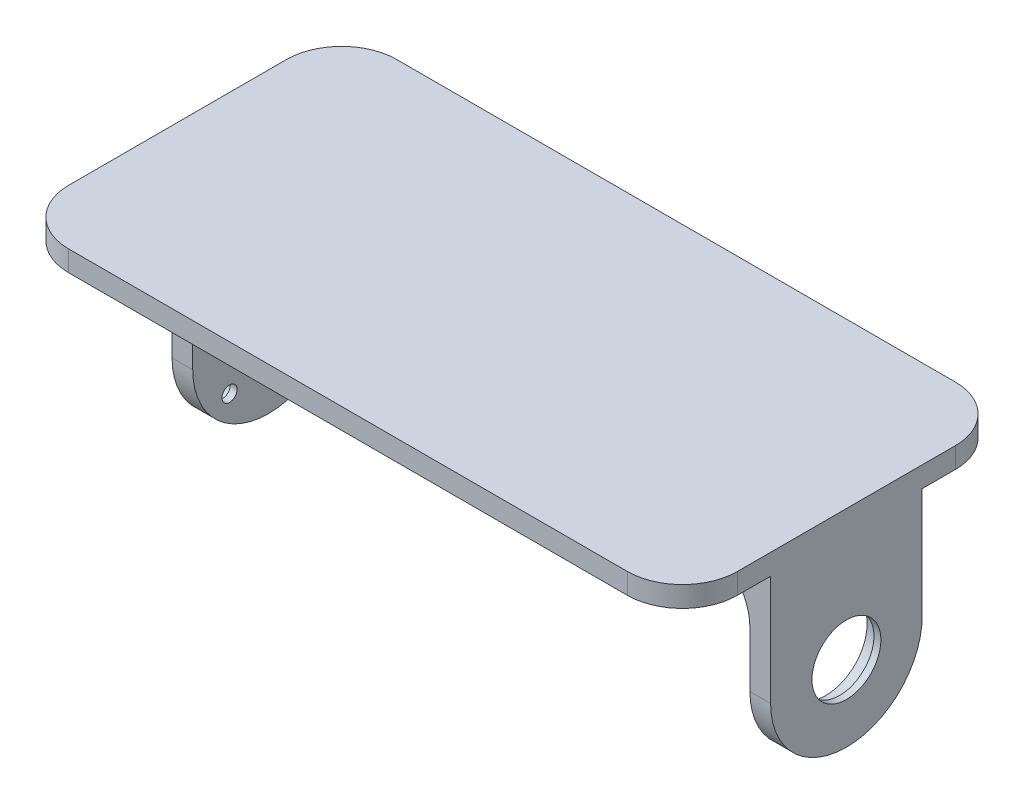
ISO-10303-21;
HEADER;
FILE_DESCRIPTION(('STEP AP214'),'2;1');
FILE_NAME('part.step','',(''),(''),'','','');
FILE_SCHEMA(('AUTOMOTIVE_DESIGN { 1 0 10303 214 1 1 1 1 }'));
ENDSEC;
DATA;
#1=APPLICATION_CONTEXT('core data for automotive mechanical design processes');
#2=APPLICATION_PROTOCOL_DEFINITION('international standard','automotive_design',2000,#1);
#3=PRODUCT_CONTEXT('',#1,'mechanical');
#4=PRODUCT('Part','Part','',(#3));
#5=PRODUCT_RELATED_PRODUCT_CATEGORY('part','',(#4));
#6=PRODUCT_DEFINITION_FORMATION('','',#4);
#7=PRODUCT_DEFINITION_CONTEXT('part definition',#1,'design');
#8=PRODUCT_DEFINITION('design','',#6,#7);
#9=PRODUCT_DEFINITION_SHAPE('','',#8);
#10=(LENGTH_UNIT() NAMED_UNIT(*) SI_UNIT(.MILLI.,.METRE.));
#11=(NAMED_UNIT(*) PLANE_ANGLE_UNIT() SI_UNIT($,.RADIAN.));
#12=(NAMED_UNIT(*) SI_UNIT($,.STERADIAN.) SOLID_ANGLE_UNIT());
#13=UNCERTAINTY_MEASURE_WITH_UNIT(LENGTH_MEASURE(1.E-05),#10,'distance_accuracy_value','');
#14=(GEOMETRIC_REPRESENTATION_CONTEXT(3) GLOBAL_UNCERTAINTY_ASSIGNED_CONTEXT((#13)) GLOBAL_UNIT_ASSIGNED_CONTEXT((#10,
#11,#12)) REPRESENTATION_CONTEXT('',''));
#15=CARTESIAN_POINT('',(0.,0.,0.));
#16=DIRECTION('',(0.,0.,1.));
#17=DIRECTION('',(1.,0.,0.));
#18=AXIS2_PLACEMENT_3D('',#15,#16,#17);
#19=CARTESIAN_POINT('',(-30.6037704958123,-21.6568542494924,5.65685424949241));
#20=DIRECTION('',(-1.,0.,0.));
#21=DIRECTION('',(0.,0.,-1.));
#22=AXIS2_PLACEMENT_3D('',#19,#20,#21);
#23=CYLINDRICAL_SURFACE('',#22,1.1);
#24=CARTESIAN_POINT('',(-39.0890518700509,-21.6568542494924,5.65685424949241));
#25=DIRECTION('',(1.,0.,0.));
#26=DIRECTION('',(0.,0.,-1.));
#27=AXIS2_PLACEMENT_3D('',#24,#25,#26);
#28=CIRCLE('',#27,1.1);
#29=CARTESIAN_POINT('',(-39.0890518700509,-21.6568542494924,4.55685424949241));
#30=VERTEX_POINT('',#29);
#31=EDGE_CURVE('E551',#30,#30,#28,.F.);
#32=ORIENTED_EDGE('',*,*,#31,.F.);
#33=EDGE_LOOP('',(#32));
#34=FACE_BOUND('',#33,.T.);
#35=CARTESIAN_POINT('',(-40.0890518700509,-21.6568542494924,5.65685424949241));
#36=DIRECTION('',(1.,0.,0.));
#37=DIRECTION('',(0.,0.,-1.));
#38=AXIS2_PLACEMENT_3D('',#35,#36,#37);
#39=CIRCLE('',#38,1.1);
#40=CARTESIAN_POINT('',(-40.0890518700509,-21.6568542494924,4.55685424949241));
#41=VERTEX_POINT('',#40);
#42=EDGE_CURVE('E276',#41,#41,#39,.F.);
#43=ORIENTED_EDGE('',*,*,#42,.T.);
#44=EDGE_LOOP('',(#43));
#45=FACE_BOUND('',#44,.T.);
#46=ADVANCED_FACE('F37',(#34,#45),#23,.F.);
#47=CARTESIAN_POINT('',(-30.6037704958123,-21.6568542494924,-5.65685424949237));
#48=DIRECTION('',(-1.,0.,0.));
#49=DIRECTION('',(0.,0.,-1.));
#50=AXIS2_PLACEMENT_3D('',#47,#48,#49);
#51=CYLINDRICAL_SURFACE('',#50,1.1);
#52=CARTESIAN_POINT('',(-39.0890518700509,-21.6568542494924,-5.65685424949237));
#53=DIRECTION('',(1.,0.,0.));
#54=DIRECTION('',(0.,0.,-1.));
#55=AXIS2_PLACEMENT_3D('',#52,#53,#54);
#56=CIRCLE('',#55,1.1);
#57=CARTESIAN_POINT('',(-39.0890518700509,-21.6568542494924,-6.75685424949237));
#58=VERTEX_POINT('',#57);
#59=EDGE_CURVE('E548',#58,#58,#56,.F.);
#60=ORIENTED_EDGE('',*,*,#59,.F.);
#61=EDGE_LOOP('',(#60));
#62=FACE_BOUND('',#61,.T.);
#63=CARTESIAN_POINT('',(-40.0890518700509,-21.6568542494924,-5.65685424949237));
#64=DIRECTION('',(1.,0.,0.));
#65=DIRECTION('',(0.,0.,-1.));
#66=AXIS2_PLACEMENT_3D('',#63,#64,#65);
#67=CIRCLE('',#66,1.1);
#68=CARTESIAN_POINT('',(-40.0890518700509,-21.6568542494924,-6.75685424949237));
#69=VERTEX_POINT('',#68);
#70=EDGE_CURVE('E272',#69,#69,#67,.F.);
#71=ORIENTED_EDGE('',*,*,#70,.T.);
#72=EDGE_LOOP('',(#71));
#73=FACE_BOUND('',#72,.T.);
#74=ADVANCED_FACE('F409',(#62,#73),#51,.F.);
#75=CARTESIAN_POINT('',(-30.6037704958123,-10.3431457505077,5.65685424949241));
#76=DIRECTION('',(-1.,0.,0.));
#77=DIRECTION('',(0.,0.,-1.));
#78=AXIS2_PLACEMENT_3D('',#75,#76,#77);
#79=CYLINDRICAL_SURFACE('',#78,1.1);
#80=CARTESIAN_POINT('',(-39.0890518700509,-10.3431457505077,5.65685424949241));
#81=DIRECTION('',(1.,0.,0.));
#82=DIRECTION('',(0.,0.,-1.));
#83=AXIS2_PLACEMENT_3D('',#80,#81,#82);
#84=CIRCLE('',#83,1.1);
#85=CARTESIAN_POINT('',(-39.0890518700509,-10.3431457505077,4.55685424949241));
#86=VERTEX_POINT('',#85);
#87=EDGE_CURVE('E262',#86,#86,#84,.F.);
#88=ORIENTED_EDGE('',*,*,#87,.F.);
#89=EDGE_LOOP('',(#88));
#90=FACE_BOUND('',#89,.T.);
#91=CARTESIAN_POINT('',(-40.0890518700509,-10.3431457505077,5.65685424949241));
#92=DIRECTION('',(1.,0.,0.));
#93=DIRECTION('',(0.,0.,-1.));
#94=AXIS2_PLACEMENT_3D('',#91,#92,#93);
#95=CIRCLE('',#94,1.1);
#96=CARTESIAN_POINT('',(-40.0890518700509,-10.3431457505077,4.55685424949241));
#97=VERTEX_POINT('',#96);
#98=EDGE_CURVE('E269',#97,#97,#95,.F.);
#99=ORIENTED_EDGE('',*,*,#98,.T.);
#100=EDGE_LOOP('',(#99));
#101=FACE_BOUND('',#100,.T.);
#102=ADVANCED_FACE('F415',(#90,#101),#79,.F.);
#103=CARTESIAN_POINT('',(-30.6037704958123,-10.3431457505077,-5.65685424949241));
#104=DIRECTION('',(-1.,0.,0.));
#105=DIRECTION('',(0.,0.,-1.));
#106=AXIS2_PLACEMENT_3D('',#103,#104,#105);
#107=CYLINDRICAL_SURFACE('',#106,1.1);
#108=CARTESIAN_POINT('',(-39.0890518700509,-10.3431457505077,-5.65685424949241));
#109=DIRECTION('',(1.,0.,0.));
#110=DIRECTION('',(0.,0.,-1.));
#111=AXIS2_PLACEMENT_3D('',#108,#109,#110);
#112=CIRCLE('',#111,1.1);
#113=CARTESIAN_POINT('',(-39.0890518700509,-10.3431457505077,-6.75685424949241));
#114=VERTEX_POINT('',#113);
#115=EDGE_CURVE('E545',#114,#114,#112,.F.);
#116=ORIENTED_EDGE('',*,*,#115,.F.);
#117=EDGE_LOOP('',(#116));
#118=FACE_BOUND('',#117,.T.);
#119=CARTESIAN_POINT('',(-40.0890518700509,-10.3431457505077,-5.65685424949241));
#120=DIRECTION('',(1.,0.,0.));
#121=DIRECTION('',(0.,0.,-1.));
#122=AXIS2_PLACEMENT_3D('',#119,#120,#121);
#123=CIRCLE('',#122,1.1);
#124=CARTESIAN_POINT('',(-40.0890518700509,-10.3431457505077,-6.75685424949241));
#125=VERTEX_POINT('',#124);
#126=EDGE_CURVE('E265',#125,#125,#123,.F.);
#127=ORIENTED_EDGE('',*,*,#126,.T.);
#128=EDGE_LOOP('',(#127));
#129=FACE_BOUND('',#128,.T.);
#130=ADVANCED_FACE('F450',(#118,#129),#107,.F.);
#131=CARTESIAN_POINT('',(0.,0.,0.));
#132=DIRECTION('',(0.,1.,0.));
#133=DIRECTION('',(0.,0.,-1.));
#134=AXIS2_PLACEMENT_3D('',#131,#132,#133);
#135=PLANE('',#134);
#136=DIRECTION('',(1.,0.,0.));
#137=VECTOR('',#136,1.);
#138=CARTESIAN_POINT('',(-42.0890518700509,0.,11.));
#139=LINE('',#138,#137);
#140=CARTESIAN_POINT('',(-50.0890518700509,0.,11.));
#141=VERTEX_POINT('',#140);
#142=CARTESIAN_POINT('',(-31.0890518700509,0.,11.));
#143=VERTEX_POINT('',#142);
#144=EDGE_CURVE('E348',#141,#143,#139,.T.);
#145=ORIENTED_EDGE('',*,*,#144,.T.);
#146=DIRECTION('',(0.,0.,-1.));
#147=VECTOR('',#146,1.);
#148=CARTESIAN_POINT('',(-31.0890518700509,0.,11.));
#149=LINE('',#148,#147);
#150=CARTESIAN_POINT('',(-31.0890518700509,0.,-11.));
#151=VERTEX_POINT('',#150);
#152=EDGE_CURVE('E284',#151,#143,#149,.F.);
#153=ORIENTED_EDGE('',*,*,#152,.F.);
#154=DIRECTION('',(-1.,0.,0.));
#155=VECTOR('',#154,1.);
#156=CARTESIAN_POINT('',(-42.0890518700509,0.,-11.));
#157=LINE('',#156,#155);
#158=CARTESIAN_POINT('',(-50.0890518700509,0.,-11.));
#159=VERTEX_POINT('',#158);
#160=EDGE_CURVE('E342',#151,#159,#157,.T.);
#161=ORIENTED_EDGE('',*,*,#160,.T.);
#162=DIRECTION('',(0.,0.,1.));
#163=VECTOR('',#162,1.);
#164=CARTESIAN_POINT('',(-50.0890518700509,0.,-11.));
#165=LINE('',#164,#163);
#166=EDGE_CURVE('E289',#141,#159,#165,.F.);
#167=ORIENTED_EDGE('',*,*,#166,.F.);
#168=EDGE_LOOP('',(#145,#153,#161,#167));
#169=FACE_BOUND('',#168,.T.);
#170=DIRECTION('',(1.,0.,0.));
#171=VECTOR('',#170,1.);
#172=CARTESIAN_POINT('',(-52.2890518700509,0.,-23.8));
#173=LINE('',#172,#171);
#174=CARTESIAN_POINT('',(-44.2890518700509,0.,-23.8));
#175=VERTEX_POINT('',#174);
#176=CARTESIAN_POINT('',(36.7609481299491,0.,-23.8));
#177=VERTEX_POINT('',#176);
#178=EDGE_CURVE('E214',#175,#177,#173,.T.);
#179=ORIENTED_EDGE('',*,*,#178,.T.);
#180=CARTESIAN_POINT('',(36.7609481299491,0.,-15.8));
#181=DIRECTION('',(0.,-1.,0.));
#182=DIRECTION('',(0.,0.,-1.));
#183=AXIS2_PLACEMENT_3D('',#180,#181,#182);
#184=CIRCLE('',#183,8.);
#185=CARTESIAN_POINT('',(44.7609481299491,0.,-15.8));
#186=VERTEX_POINT('',#185);
#187=EDGE_CURVE('E209',#186,#177,#184,.F.);
#188=ORIENTED_EDGE('',*,*,#187,.F.);
#189=DIRECTION('',(0.,0.,-1.));
#190=VECTOR('',#189,1.);
#191=CARTESIAN_POINT('',(44.7609481299491,0.,-11.));
#192=LINE('',#191,#190);
#193=CARTESIAN_POINT('',(44.7609481299491,0.,-11.));
#194=VERTEX_POINT('',#193);
#195=EDGE_CURVE('E187',#194,#186,#192,.T.);
#196=ORIENTED_EDGE('',*,*,#195,.F.);
#197=DIRECTION('',(-1.,0.,0.));
#198=VECTOR('',#197,1.);
#199=CARTESIAN_POINT('',(41.7609481299491,0.,-11.));
#200=LINE('',#199,#198);
#201=CARTESIAN_POINT('',(33.7609481299491,0.,-11.));
#202=VERTEX_POINT('',#201);
#203=EDGE_CURVE('E197',#194,#202,#200,.T.);
#204=ORIENTED_EDGE('',*,*,#203,.T.);
#205=DIRECTION('',(0.,0.,1.));
#206=VECTOR('',#205,1.);
#207=CARTESIAN_POINT('',(33.7609481299491,0.,-11.));
#208=LINE('',#207,#206);
#209=CARTESIAN_POINT('',(33.7609481299491,0.,11.));
#210=VERTEX_POINT('',#209);
#211=EDGE_CURVE('E287',#210,#202,#208,.F.);
#212=ORIENTED_EDGE('',*,*,#211,.F.);
#213=DIRECTION('',(1.,0.,0.));
#214=VECTOR('',#213,1.);
#215=CARTESIAN_POINT('',(41.7609481299491,0.,11.));
#216=LINE('',#215,#214);
#217=CARTESIAN_POINT('',(44.7609481299491,0.,11.));
#218=VERTEX_POINT('',#217);
#219=EDGE_CURVE('E204',#210,#218,#216,.T.);
#220=ORIENTED_EDGE('',*,*,#219,.T.);
#221=CARTESIAN_POINT('',(44.7609481299491,0.,15.8));
#222=VERTEX_POINT('',#221);
#223=EDGE_CURVE('E210',#222,#218,#192,.T.);
#224=ORIENTED_EDGE('',*,*,#223,.F.);
#225=CARTESIAN_POINT('',(36.7609481299491,0.,15.8));
#226=DIRECTION('',(0.,-1.,0.));
#227=DIRECTION('',(0.,0.,-1.));
#228=AXIS2_PLACEMENT_3D('',#225,#226,#227);
#229=CIRCLE('',#228,8.);
#230=CARTESIAN_POINT('',(36.7609481299491,0.,23.8));
#231=VERTEX_POINT('',#230);
#232=EDGE_CURVE('E295',#231,#222,#229,.F.);
#233=ORIENTED_EDGE('',*,*,#232,.F.);
#234=DIRECTION('',(-1.,0.,0.));
#235=VECTOR('',#234,1.);
#236=CARTESIAN_POINT('',(44.7609481299491,0.,23.8));
#237=LINE('',#236,#235);
#238=CARTESIAN_POINT('',(-44.2890518700509,0.,23.8));
#239=VERTEX_POINT('',#238);
#240=EDGE_CURVE('E226',#231,#239,#237,.T.);
#241=ORIENTED_EDGE('',*,*,#240,.T.);
#242=CARTESIAN_POINT('',(-44.2890518700509,0.,15.8));
#243=DIRECTION('',(0.,-1.,0.));
#244=DIRECTION('',(0.,0.,-1.));
#245=AXIS2_PLACEMENT_3D('',#242,#243,#244);
#246=CIRCLE('',#245,8.);
#247=CARTESIAN_POINT('',(-52.2890518700509,0.,15.8));
#248=VERTEX_POINT('',#247);
#249=EDGE_CURVE('E292',#248,#239,#246,.F.);
#250=ORIENTED_EDGE('',*,*,#249,.F.);
#251=DIRECTION('',(0.,0.,1.));
#252=VECTOR('',#251,1.);
#253=CARTESIAN_POINT('',(-52.2890518700509,0.,11.));
#254=LINE('',#253,#252);
#255=CARTESIAN_POINT('',(-52.2890518700509,0.,-15.8));
#256=VERTEX_POINT('',#255);
#257=EDGE_CURVE('E223',#256,#248,#254,.T.);
#258=ORIENTED_EDGE('',*,*,#257,.F.);
#259=CARTESIAN_POINT('',(-44.2890518700509,0.,-15.8));
#260=DIRECTION('',(0.,-1.,0.));
#261=DIRECTION('',(0.,0.,-1.));
#262=AXIS2_PLACEMENT_3D('',#259,#260,#261);
#263=CIRCLE('',#262,8.);
#264=EDGE_CURVE('E299',#175,#256,#263,.F.);
#265=ORIENTED_EDGE('',*,*,#264,.F.);
#266=EDGE_LOOP('',(#179,#188,#196,#204,#212,#220,#224,#233,#241,#250,#258,#265));
#267=FACE_BOUND('',#266,.T.);
#268=ADVANCED_FACE('F207',(#169,#267),#135,.F.);
#269=CARTESIAN_POINT('',(44.7609481299491,3.,23.8));
#270=DIRECTION('',(0.,0.,-1.));
#271=DIRECTION('',(1.,0.,0.));
#272=AXIS2_PLACEMENT_3D('',#269,#270,#271);
#273=PLANE('',#272);
#274=DIRECTION('',(-1.,0.,0.));
#275=VECTOR('',#274,1.);
#276=CARTESIAN_POINT('',(44.7609481299491,3.,23.8));
#277=LINE('',#276,#275);
#278=CARTESIAN_POINT('',(36.7609481299491,3.,23.8));
#279=VERTEX_POINT('',#278);
#280=CARTESIAN_POINT('',(-44.2890518700509,3.,23.8));
#281=VERTEX_POINT('',#280);
#282=EDGE_CURVE('E220',#279,#281,#277,.T.);
#283=ORIENTED_EDGE('',*,*,#282,.T.);
#284=DIRECTION('',(0.,-1.,0.));
#285=VECTOR('',#284,1.);
#286=CARTESIAN_POINT('',(-44.2890518700509,3.,23.8));
#287=LINE('',#286,#285);
#288=EDGE_CURVE('E320',#239,#281,#287,.F.);
#289=ORIENTED_EDGE('',*,*,#288,.F.);
#290=ORIENTED_EDGE('',*,*,#240,.F.);
#291=DIRECTION('',(0.,-1.,0.));
#292=VECTOR('',#291,1.);
#293=CARTESIAN_POINT('',(36.7609481299491,0.,23.8));
#294=LINE('',#293,#292);
#295=EDGE_CURVE('E323',#279,#231,#294,.T.);
#296=ORIENTED_EDGE('',*,*,#295,.F.);
#297=EDGE_LOOP('',(#283,#289,#290,#296));
#298=FACE_BOUND('',#297,.T.);
#299=ADVANCED_FACE('F376',(#298),#273,.F.);
#300=CARTESIAN_POINT('',(-52.2890518700509,3.,11.));
#301=DIRECTION('',(-1.,0.,0.));
#302=DIRECTION('',(0.,0.,-1.));
#303=AXIS2_PLACEMENT_3D('',#300,#301,#302);
#304=PLANE('',#303);
#305=ORIENTED_EDGE('',*,*,#257,.T.);
#306=DIRECTION('',(0.,-1.,0.));
#307=VECTOR('',#306,1.);
#308=CARTESIAN_POINT('',(-52.2890518700509,0.,15.8));
#309=LINE('',#308,#307);
#310=CARTESIAN_POINT('',(-52.2890518700509,3.,15.8));
#311=VERTEX_POINT('',#310);
#312=EDGE_CURVE('E302',#311,#248,#309,.T.);
#313=ORIENTED_EDGE('',*,*,#312,.F.);
#314=DIRECTION('',(0.,0.,-1.));
#315=VECTOR('',#314,1.);
#316=CARTESIAN_POINT('',(-52.2890518700509,3.,-11.));
#317=LINE('',#316,#315);
#318=CARTESIAN_POINT('',(-52.2890518700509,3.,-15.8));
#319=VERTEX_POINT('',#318);
#320=EDGE_CURVE('E367',#311,#319,#317,.T.);
#321=ORIENTED_EDGE('',*,*,#320,.T.);
#322=DIRECTION('',(0.,-1.,0.));
#323=VECTOR('',#322,1.);
#324=CARTESIAN_POINT('',(-52.2890518700509,3.,-15.8));
#325=LINE('',#324,#323);
#326=EDGE_CURVE('E304',#256,#319,#325,.F.);
#327=ORIENTED_EDGE('',*,*,#326,.F.);
#328=EDGE_LOOP('',(#305,#313,#321,#327));
#329=FACE_BOUND('',#328,.T.);
#330=ADVANCED_FACE('F399',(#329),#304,.T.);
#331=CARTESIAN_POINT('',(-52.2890518700509,3.,-23.8));
#332=DIRECTION('',(0.,0.,1.));
#333=DIRECTION('',(-1.,0.,0.));
#334=AXIS2_PLACEMENT_3D('',#331,#332,#333);
#335=PLANE('',#334);
#336=DIRECTION('',(1.,0.,0.));
#337=VECTOR('',#336,1.);
#338=CARTESIAN_POINT('',(-52.2890518700509,3.,-23.8));
#339=LINE('',#338,#337);
#340=CARTESIAN_POINT('',(-44.2890518700509,3.,-23.8));
#341=VERTEX_POINT('',#340);
#342=CARTESIAN_POINT('',(36.7609481299491,3.,-23.8));
#343=VERTEX_POINT('',#342);
#344=EDGE_CURVE('E365',#341,#343,#339,.T.);
#345=ORIENTED_EDGE('',*,*,#344,.T.);
#346=DIRECTION('',(0.,-1.,0.));
#347=VECTOR('',#346,1.);
#348=CARTESIAN_POINT('',(36.7609481299491,3.,-23.8));
#349=LINE('',#348,#347);
#350=EDGE_CURVE('E259',#177,#343,#349,.F.);
#351=ORIENTED_EDGE('',*,*,#350,.F.);
#352=ORIENTED_EDGE('',*,*,#178,.F.);
#353=DIRECTION('',(0.,-1.,0.));
#354=VECTOR('',#353,1.);
#355=CARTESIAN_POINT('',(-44.2890518700509,0.,-23.8));
#356=LINE('',#355,#354);
#357=EDGE_CURVE('E282',#341,#175,#356,.T.);
#358=ORIENTED_EDGE('',*,*,#357,.F.);
#359=EDGE_LOOP('',(#345,#351,#352,#358));
#360=FACE_BOUND('',#359,.T.);
#361=ADVANCED_FACE('F395',(#360),#335,.F.);
#362=CARTESIAN_POINT('',(44.7609481299491,3.,-11.));
#363=DIRECTION('',(1.,0.,0.));
#364=DIRECTION('',(0.,0.,1.));
#365=AXIS2_PLACEMENT_3D('',#362,#363,#364);
#366=PLANE('',#365);
#367=CARTESIAN_POINT('',(44.7609481299491,-16.,0.));
#368=DIRECTION('',(-1.,0.,0.));
#369=DIRECTION('',(0.,0.,1.));
#370=AXIS2_PLACEMENT_3D('',#367,#368,#369);
#371=CIRCLE('',#370,5.);
#372=CARTESIAN_POINT('',(44.7609481299491,-16.,4.99999999999999));
#373=VERTEX_POINT('',#372);
#374=EDGE_CURVE('E521',#373,#373,#371,.F.);
#375=ORIENTED_EDGE('',*,*,#374,.F.);
#376=EDGE_LOOP('',(#375));
#377=FACE_BOUND('',#376,.T.);
#378=DIRECTION('',(0.,0.,-1.));
#379=VECTOR('',#378,1.);
#380=CARTESIAN_POINT('',(44.7609481299491,3.,23.8));
#381=LINE('',#380,#379);
#382=CARTESIAN_POINT('',(44.7609481299491,3.,15.8));
#383=VERTEX_POINT('',#382);
#384=CARTESIAN_POINT('',(44.7609481299491,3.,-15.8));
#385=VERTEX_POINT('',#384);
#386=EDGE_CURVE('E229',#383,#385,#381,.T.);
#387=ORIENTED_EDGE('',*,*,#386,.F.);
#388=DIRECTION('',(0.,-1.,0.));
#389=VECTOR('',#388,1.);
#390=CARTESIAN_POINT('',(44.7609481299491,3.,15.8));
#391=LINE('',#390,#389);
#392=EDGE_CURVE('E315',#222,#383,#391,.F.);
#393=ORIENTED_EDGE('',*,*,#392,.F.);
#394=ORIENTED_EDGE('',*,*,#223,.T.);
#395=DIRECTION('',(0.,1.,0.));
#396=VECTOR('',#395,1.);
#397=CARTESIAN_POINT('',(44.7609481299491,-27.,11.));
#398=LINE('',#397,#396);
#399=CARTESIAN_POINT('',(44.7609481299491,-16.,11.));
#400=VERTEX_POINT('',#399);
#401=EDGE_CURVE('E193',#400,#218,#398,.T.);
#402=ORIENTED_EDGE('',*,*,#401,.F.);
#403=CARTESIAN_POINT('',(44.7609481299491,-16.,0.));
#404=DIRECTION('',(-1.,0.,0.));
#405=DIRECTION('',(0.,0.,1.));
#406=AXIS2_PLACEMENT_3D('',#403,#404,#405);
#407=CIRCLE('',#406,11.);
#408=CARTESIAN_POINT('',(44.7609481299491,-27.,0.));
#409=VERTEX_POINT('',#408);
#410=EDGE_CURVE('E246',#409,#400,#407,.T.);
#411=ORIENTED_EDGE('',*,*,#410,.F.);
#412=CARTESIAN_POINT('',(44.7609481299491,-16.,0.));
#413=DIRECTION('',(-1.,0.,0.));
#414=DIRECTION('',(0.,0.,1.));
#415=AXIS2_PLACEMENT_3D('',#412,#413,#414);
#416=CIRCLE('',#415,11.);
#417=CARTESIAN_POINT('',(44.7609481299491,-16.,-11.));
#418=VERTEX_POINT('',#417);
#419=EDGE_CURVE('E191',#418,#409,#416,.T.);
#420=ORIENTED_EDGE('',*,*,#419,.F.);
#421=DIRECTION('',(0.,1.,0.));
#422=VECTOR('',#421,1.);
#423=CARTESIAN_POINT('',(44.7609481299491,-27.,-11.));
#424=LINE('',#423,#422);
#425=EDGE_CURVE('E181',#418,#194,#424,.T.);
#426=ORIENTED_EDGE('',*,*,#425,.T.);
#427=ORIENTED_EDGE('',*,*,#195,.T.);
#428=DIRECTION('',(0.,-1.,0.));
#429=VECTOR('',#428,1.);
#430=CARTESIAN_POINT('',(44.7609481299491,0.,-15.8));
#431=LINE('',#430,#429);
#432=EDGE_CURVE('E318',#385,#186,#431,.T.);
#433=ORIENTED_EDGE('',*,*,#432,.F.);
#434=EDGE_LOOP('',(#387,#393,#394,#402,#411,#420,#426,#427,#433));
#435=FACE_BOUND('',#434,.T.);
#436=ADVANCED_FACE('F184',(#377,#435),#366,.T.);
#437=CARTESIAN_POINT('',(0.,3.,0.));
#438=DIRECTION('',(0.,1.,0.));
#439=DIRECTION('',(0.,0.,-1.));
#440=AXIS2_PLACEMENT_3D('',#437,#438,#439);
#441=PLANE('',#440);
#442=ORIENTED_EDGE('',*,*,#320,.F.);
#443=CARTESIAN_POINT('',(-44.2890518700509,3.,15.8));
#444=DIRECTION('',(0.,-1.,0.));
#445=DIRECTION('',(0.,0.,-1.));
#446=AXIS2_PLACEMENT_3D('',#443,#444,#445);
#447=CIRCLE('',#446,8.);
#448=EDGE_CURVE('E307',#281,#311,#447,.T.);
#449=ORIENTED_EDGE('',*,*,#448,.F.);
#450=ORIENTED_EDGE('',*,*,#282,.F.);
#451=CARTESIAN_POINT('',(36.7609481299491,3.,15.8));
#452=DIRECTION('',(0.,-1.,0.));
#453=DIRECTION('',(0.,0.,-1.));
#454=AXIS2_PLACEMENT_3D('',#451,#452,#453);
#455=CIRCLE('',#454,8.);
#456=EDGE_CURVE('E309',#383,#279,#455,.T.);
#457=ORIENTED_EDGE('',*,*,#456,.F.);
#458=ORIENTED_EDGE('',*,*,#386,.T.);
#459=CARTESIAN_POINT('',(36.7609481299491,3.,-15.8));
#460=DIRECTION('',(0.,-1.,0.));
#461=DIRECTION('',(0.,0.,-1.));
#462=AXIS2_PLACEMENT_3D('',#459,#460,#461);
#463=CIRCLE('',#462,8.);
#464=EDGE_CURVE('E311',#343,#385,#463,.T.);
#465=ORIENTED_EDGE('',*,*,#464,.F.);
#466=ORIENTED_EDGE('',*,*,#344,.F.);
#467=CARTESIAN_POINT('',(-44.2890518700509,3.,-15.8));
#468=DIRECTION('',(0.,-1.,0.));
#469=DIRECTION('',(0.,0.,-1.));
#470=AXIS2_PLACEMENT_3D('',#467,#468,#469);
#471=CIRCLE('',#470,8.);
#472=EDGE_CURVE('E313',#319,#341,#471,.T.);
#473=ORIENTED_EDGE('',*,*,#472,.F.);
#474=EDGE_LOOP('',(#442,#449,#450,#457,#458,#465,#466,#473));
#475=FACE_BOUND('',#474,.T.);
#476=ADVANCED_FACE('F379',(#475),#441,.T.);
#477=CARTESIAN_POINT('',(-42.0890518700509,-27.,-11.));
#478=DIRECTION('',(1.,0.,0.));
#479=DIRECTION('',(0.,0.,1.));
#480=AXIS2_PLACEMENT_3D('',#477,#478,#479);
#481=PLANE('',#480);
#482=CARTESIAN_POINT('',(-42.0890518700509,-10.3431457505076,5.65685424949237));
#483=DIRECTION('',(1.,0.,0.));
#484=DIRECTION('',(0.,1.,0.));
#485=AXIS2_PLACEMENT_3D('',#482,#483,#484);
#486=CIRCLE('',#485,2.);
#487=CARTESIAN_POINT('',(-42.0890518700509,-8.3431457505076,5.65685424949237));
#488=VERTEX_POINT('',#487);
#489=EDGE_CURVE('E525',#488,#488,#486,.T.);
#490=ORIENTED_EDGE('',*,*,#489,.T.);
#491=EDGE_LOOP('',(#490));
#492=FACE_BOUND('',#491,.T.);
#493=CARTESIAN_POINT('',(-42.0890518700509,-21.6568542494923,5.65685424949242));
#494=DIRECTION('',(1.,0.,0.));
#495=DIRECTION('',(0.,0.,1.));
#496=AXIS2_PLACEMENT_3D('',#493,#494,#495);
#497=CIRCLE('',#496,2.);
#498=CARTESIAN_POINT('',(-42.0890518700509,-21.6568542494923,7.65685424949242));
#499=VERTEX_POINT('',#498);
#500=EDGE_CURVE('E531',#499,#499,#497,.T.);
#501=ORIENTED_EDGE('',*,*,#500,.T.);
#502=EDGE_LOOP('',(#501));
#503=FACE_BOUND('',#502,.T.);
#504=CARTESIAN_POINT('',(-42.0890518700509,-21.6568542494924,-5.65685424949241));
#505=DIRECTION('',(1.,0.,0.));
#506=DIRECTION('',(0.,-1.,0.));
#507=AXIS2_PLACEMENT_3D('',#504,#505,#506);
#508=CIRCLE('',#507,2.);
#509=CARTESIAN_POINT('',(-42.0890518700509,-23.6568542494924,-5.65685424949243));
#510=VERTEX_POINT('',#509);
#511=EDGE_CURVE('E524',#510,#510,#508,.T.);
#512=ORIENTED_EDGE('',*,*,#511,.T.);
#513=EDGE_LOOP('',(#512));
#514=FACE_BOUND('',#513,.T.);
#515=CARTESIAN_POINT('',(-42.0890518700509,-10.3431457505077,-5.65685424949242));
#516=DIRECTION('',(1.,0.,0.));
#517=DIRECTION('',(0.,0.,-1.));
#518=AXIS2_PLACEMENT_3D('',#515,#516,#517);
#519=CIRCLE('',#518,2.);
#520=CARTESIAN_POINT('',(-42.0890518700509,-10.3431457505077,-7.65685424949242));
#521=VERTEX_POINT('',#520);
#522=EDGE_CURVE('E279',#521,#521,#519,.T.);
#523=ORIENTED_EDGE('',*,*,#522,.T.);
#524=EDGE_LOOP('',(#523));
#525=FACE_BOUND('',#524,.T.);
#526=CARTESIAN_POINT('',(-42.0890518700509,-16.,0.));
#527=DIRECTION('',(1.,0.,0.));
#528=DIRECTION('',(0.,0.,-1.));
#529=AXIS2_PLACEMENT_3D('',#526,#527,#528);
#530=CIRCLE('',#529,3.);
#531=CARTESIAN_POINT('',(-42.0890518700509,-16.,-3.));
#532=VERTEX_POINT('',#531);
#533=EDGE_CURVE('E554',#532,#532,#530,.T.);
#534=ORIENTED_EDGE('',*,*,#533,.T.);
#535=EDGE_LOOP('',(#534));
#536=FACE_BOUND('',#535,.T.);
#537=DIRECTION('',(0.,1.,0.));
#538=VECTOR('',#537,1.);
#539=CARTESIAN_POINT('',(-42.0890518700509,-27.,-11.));
#540=LINE('',#539,#538);
#541=CARTESIAN_POINT('',(-42.0890518700509,-16.,-11.));
#542=VERTEX_POINT('',#541);
#543=CARTESIAN_POINT('',(-42.0890518700509,-8.,-11.));
#544=VERTEX_POINT('',#543);
#545=EDGE_CURVE('E347',#542,#544,#540,.T.);
#546=ORIENTED_EDGE('',*,*,#545,.F.);
#547=CARTESIAN_POINT('',(-42.0890518700509,-16.,0.));
#548=DIRECTION('',(-1.,0.,0.));
#549=DIRECTION('',(0.,0.,1.));
#550=AXIS2_PLACEMENT_3D('',#547,#548,#549);
#551=CIRCLE('',#550,11.);
#552=CARTESIAN_POINT('',(-42.0890518700509,-27.,0.));
#553=VERTEX_POINT('',#552);
#554=EDGE_CURVE('E237',#553,#542,#551,.F.);
#555=ORIENTED_EDGE('',*,*,#554,.F.);
#556=CARTESIAN_POINT('',(-42.0890518700509,-16.,0.));
#557=DIRECTION('',(-1.,0.,0.));
#558=DIRECTION('',(0.,0.,1.));
#559=AXIS2_PLACEMENT_3D('',#556,#557,#558);
#560=CIRCLE('',#559,11.);
#561=CARTESIAN_POINT('',(-42.0890518700509,-16.,11.));
#562=VERTEX_POINT('',#561);
#563=EDGE_CURVE('E240',#562,#553,#560,.F.);
#564=ORIENTED_EDGE('',*,*,#563,.F.);
#565=DIRECTION('',(0.,1.,0.));
#566=VECTOR('',#565,1.);
#567=CARTESIAN_POINT('',(-42.0890518700509,-27.,11.));
#568=LINE('',#567,#566);
#569=CARTESIAN_POINT('',(-42.0890518700509,-8.,11.));
#570=VERTEX_POINT('',#569);
#571=EDGE_CURVE('E211',#562,#570,#568,.T.);
#572=ORIENTED_EDGE('',*,*,#571,.T.);
#573=DIRECTION('',(0.,0.,1.));
#574=VECTOR('',#573,1.);
#575=CARTESIAN_POINT('',(-42.0890518700509,-8.,11.));
#576=LINE('',#575,#574);
#577=EDGE_CURVE('E325',#544,#570,#576,.T.);
#578=ORIENTED_EDGE('',*,*,#577,.F.);
#579=EDGE_LOOP('',(#546,#555,#564,#572,#578));
#580=FACE_BOUND('',#579,.T.);
#581=ADVANCED_FACE('F443',(#492,#503,#514,#525,#536,#580),#481,.F.);
#582=CARTESIAN_POINT('',(-42.0890518700509,-27.,11.));
#583=DIRECTION('',(0.,0.,-1.));
#584=DIRECTION('',(1.,0.,0.));
#585=AXIS2_PLACEMENT_3D('',#582,#583,#584);
#586=PLANE('',#585);
#587=DIRECTION('',(0.,1.,0.));
#588=VECTOR('',#587,1.);
#589=CARTESIAN_POINT('',(-39.0890518700509,-27.,11.));
#590=LINE('',#589,#588);
#591=CARTESIAN_POINT('',(-39.0890518700509,-16.,11.));
#592=VERTEX_POINT('',#591);
#593=CARTESIAN_POINT('',(-39.0890518700509,-8.,11.));
#594=VERTEX_POINT('',#593);
#595=EDGE_CURVE('E216',#592,#594,#590,.T.);
#596=ORIENTED_EDGE('',*,*,#595,.T.);
#597=CARTESIAN_POINT('',(-31.0890518700509,-8.,11.));
#598=DIRECTION('',(0.,0.,1.));
#599=DIRECTION('',(1.,0.,0.));
#600=AXIS2_PLACEMENT_3D('',#597,#598,#599);
#601=CIRCLE('',#600,8.);
#602=EDGE_CURVE('E12',#143,#594,#601,.T.);
#603=ORIENTED_EDGE('',*,*,#602,.F.);
#604=ORIENTED_EDGE('',*,*,#144,.F.);
#605=CARTESIAN_POINT('',(-50.0890518700509,-8.,11.));
#606=DIRECTION('',(0.,0.,1.));
#607=DIRECTION('',(1.,0.,0.));
#608=AXIS2_PLACEMENT_3D('',#605,#606,#607);
#609=CIRCLE('',#608,8.);
#610=EDGE_CURVE('E332',#570,#141,#609,.T.);
#611=ORIENTED_EDGE('',*,*,#610,.F.);
#612=ORIENTED_EDGE('',*,*,#571,.F.);
#613=DIRECTION('',(1.,0.,0.));
#614=VECTOR('',#613,1.);
#615=CARTESIAN_POINT('',(-42.0890518700509,-16.,11.));
#616=LINE('',#615,#614);
#617=EDGE_CURVE('E235',#592,#562,#616,.F.);
#618=ORIENTED_EDGE('',*,*,#617,.F.);
#619=EDGE_LOOP('',(#596,#603,#604,#611,#612,#618));
#620=FACE_BOUND('',#619,.T.);
#621=ADVANCED_FACE('F439',(#620),#586,.F.);
#622=CARTESIAN_POINT('',(-39.0890518700509,-27.,-11.));
#623=DIRECTION('',(-1.,0.,0.));
#624=DIRECTION('',(0.,0.,-1.));
#625=AXIS2_PLACEMENT_3D('',#622,#623,#624);
#626=PLANE('',#625);
#627=ORIENTED_EDGE('',*,*,#87,.T.);
#628=EDGE_LOOP('',(#627));
#629=FACE_BOUND('',#628,.T.);
#630=ORIENTED_EDGE('',*,*,#59,.T.);
#631=EDGE_LOOP('',(#630));
#632=FACE_BOUND('',#631,.T.);
#633=ORIENTED_EDGE('',*,*,#115,.T.);
#634=EDGE_LOOP('',(#633));
#635=FACE_BOUND('',#634,.T.);
#636=CARTESIAN_POINT('',(-39.0890518700509,-16.,0.));
#637=DIRECTION('',(1.,0.,0.));
#638=DIRECTION('',(0.,0.,-1.));
#639=AXIS2_PLACEMENT_3D('',#636,#637,#638);
#640=CIRCLE('',#639,3.);
#641=CARTESIAN_POINT('',(-39.0890518700509,-16.,-3.));
#642=VERTEX_POINT('',#641);
#643=EDGE_CURVE('E557',#642,#642,#640,.F.);
#644=ORIENTED_EDGE('',*,*,#643,.T.);
#645=EDGE_LOOP('',(#644));
#646=FACE_BOUND('',#645,.T.);
#647=ORIENTED_EDGE('',*,*,#31,.T.);
#648=EDGE_LOOP('',(#647));
#649=FACE_BOUND('',#648,.T.);
#650=ORIENTED_EDGE('',*,*,#595,.F.);
#651=CARTESIAN_POINT('',(-39.0890518700509,-16.,0.));
#652=DIRECTION('',(1.,0.,0.));
#653=DIRECTION('',(0.,0.,-1.));
#654=AXIS2_PLACEMENT_3D('',#651,#652,#653);
#655=CIRCLE('',#654,11.);
#656=CARTESIAN_POINT('',(-39.0890518700509,-27.,0.));
#657=VERTEX_POINT('',#656);
#658=EDGE_CURVE('E233',#657,#592,#655,.F.);
#659=ORIENTED_EDGE('',*,*,#658,.F.);
#660=CARTESIAN_POINT('',(-39.0890518700509,-16.,0.));
#661=DIRECTION('',(1.,0.,0.));
#662=DIRECTION('',(0.,0.,-1.));
#663=AXIS2_PLACEMENT_3D('',#660,#661,#662);
#664=CIRCLE('',#663,11.);
#665=CARTESIAN_POINT('',(-39.0890518700509,-16.,-11.));
#666=VERTEX_POINT('',#665);
#667=EDGE_CURVE('E230',#666,#657,#664,.F.);
#668=ORIENTED_EDGE('',*,*,#667,.F.);
#669=DIRECTION('',(0.,1.,0.));
#670=VECTOR('',#669,1.);
#671=CARTESIAN_POINT('',(-39.0890518700509,-27.,-11.));
#672=LINE('',#671,#670);
#673=CARTESIAN_POINT('',(-39.0890518700509,-8.,-11.));
#674=VERTEX_POINT('',#673);
#675=EDGE_CURVE('E359',#666,#674,#672,.T.);
#676=ORIENTED_EDGE('',*,*,#675,.T.);
#677=DIRECTION('',(0.,0.,-1.));
#678=VECTOR('',#677,1.);
#679=CARTESIAN_POINT('',(-39.0890518700509,-8.,-11.));
#680=LINE('',#679,#678);
#681=EDGE_CURVE('E58',#594,#674,#680,.T.);
#682=ORIENTED_EDGE('',*,*,#681,.F.);
#683=EDGE_LOOP('',(#650,#659,#668,#676,#682));
#684=FACE_BOUND('',#683,.T.);
#685=ADVANCED_FACE('F436',(#629,#632,#635,#646,#649,#684),#626,.F.);
#686=CARTESIAN_POINT('',(-42.0890518700509,-27.,-11.));
#687=DIRECTION('',(0.,0.,1.));
#688=DIRECTION('',(-1.,0.,0.));
#689=AXIS2_PLACEMENT_3D('',#686,#687,#688);
#690=PLANE('',#689);
#691=ORIENTED_EDGE('',*,*,#545,.T.);
#692=CARTESIAN_POINT('',(-50.0890518700509,-8.,-11.));
#693=DIRECTION('',(0.,0.,-1.));
#694=DIRECTION('',(-1.,0.,0.));
#695=AXIS2_PLACEMENT_3D('',#692,#693,#694);
#696=CIRCLE('',#695,8.);
#697=EDGE_CURVE('E334',#159,#544,#696,.T.);
#698=ORIENTED_EDGE('',*,*,#697,.F.);
#699=ORIENTED_EDGE('',*,*,#160,.F.);
#700=CARTESIAN_POINT('',(-31.0890518700509,-8.,-11.));
#701=DIRECTION('',(0.,0.,-1.));
#702=DIRECTION('',(-1.,0.,0.));
#703=AXIS2_PLACEMENT_3D('',#700,#701,#702);
#704=CIRCLE('',#703,8.);
#705=EDGE_CURVE('E45',#674,#151,#704,.T.);
#706=ORIENTED_EDGE('',*,*,#705,.F.);
#707=ORIENTED_EDGE('',*,*,#675,.F.);
#708=DIRECTION('',(-1.,0.,0.));
#709=VECTOR('',#708,1.);
#710=CARTESIAN_POINT('',(-39.0890518700509,-16.,-11.));
#711=LINE('',#710,#709);
#712=EDGE_CURVE('E243',#542,#666,#711,.F.);
#713=ORIENTED_EDGE('',*,*,#712,.F.);
#714=EDGE_LOOP('',(#691,#698,#699,#706,#707,#713));
#715=FACE_BOUND('',#714,.T.);
#716=ADVANCED_FACE('F344',(#715),#690,.F.);
#717=CARTESIAN_POINT('',(41.7609481299491,-27.,-11.));
#718=DIRECTION('',(1.,0.,0.));
#719=DIRECTION('',(0.,0.,1.));
#720=AXIS2_PLACEMENT_3D('',#717,#718,#719);
#721=PLANE('',#720);
#722=CARTESIAN_POINT('',(41.7609481299491,-16.,0.));
#723=DIRECTION('',(1.,0.,0.));
#724=DIRECTION('',(0.,0.,-1.));
#725=AXIS2_PLACEMENT_3D('',#722,#723,#724);
#726=CIRCLE('',#725,6.);
#727=CARTESIAN_POINT('',(41.7609481299491,-16.,-6.00000000000001));
#728=VERTEX_POINT('',#727);
#729=EDGE_CURVE('E512',#728,#728,#726,.T.);
#730=ORIENTED_EDGE('',*,*,#729,.T.);
#731=EDGE_LOOP('',(#730));
#732=FACE_BOUND('',#731,.T.);
#733=DIRECTION('',(0.,1.,0.));
#734=VECTOR('',#733,1.);
#735=CARTESIAN_POINT('',(41.7609481299491,-27.,-11.));
#736=LINE('',#735,#734);
#737=CARTESIAN_POINT('',(41.7609481299491,-16.,-11.));
#738=VERTEX_POINT('',#737);
#739=CARTESIAN_POINT('',(41.7609481299491,-8.,-11.));
#740=VERTEX_POINT('',#739);
#741=EDGE_CURVE('E194',#738,#740,#736,.T.);
#742=ORIENTED_EDGE('',*,*,#741,.F.);
#743=CARTESIAN_POINT('',(41.7609481299491,-16.,0.));
#744=DIRECTION('',(-1.,0.,0.));
#745=DIRECTION('',(0.,0.,1.));
#746=AXIS2_PLACEMENT_3D('',#743,#744,#745);
#747=CIRCLE('',#746,11.);
#748=CARTESIAN_POINT('',(41.7609481299491,-27.,0.));
#749=VERTEX_POINT('',#748);
#750=EDGE_CURVE('E251',#749,#738,#747,.F.);
#751=ORIENTED_EDGE('',*,*,#750,.F.);
#752=CARTESIAN_POINT('',(41.7609481299491,-16.,0.));
#753=DIRECTION('',(-1.,0.,0.));
#754=DIRECTION('',(0.,0.,1.));
#755=AXIS2_PLACEMENT_3D('',#752,#753,#754);
#756=CIRCLE('',#755,11.);
#757=CARTESIAN_POINT('',(41.7609481299491,-16.,11.));
#758=VERTEX_POINT('',#757);
#759=EDGE_CURVE('E254',#758,#749,#756,.F.);
#760=ORIENTED_EDGE('',*,*,#759,.F.);
#761=DIRECTION('',(0.,1.,0.));
#762=VECTOR('',#761,1.);
#763=CARTESIAN_POINT('',(41.7609481299491,-27.,11.));
#764=LINE('',#763,#762);
#765=CARTESIAN_POINT('',(41.7609481299491,-8.,11.));
#766=VERTEX_POINT('',#765);
#767=EDGE_CURVE('E352',#758,#766,#764,.T.);
#768=ORIENTED_EDGE('',*,*,#767,.T.);
#769=DIRECTION('',(0.,0.,1.));
#770=VECTOR('',#769,1.);
#771=CARTESIAN_POINT('',(41.7609481299491,-8.,11.));
#772=LINE('',#771,#770);
#773=EDGE_CURVE('E328',#740,#766,#772,.T.);
#774=ORIENTED_EDGE('',*,*,#773,.F.);
#775=EDGE_LOOP('',(#742,#751,#760,#768,#774));
#776=FACE_BOUND('',#775,.T.);
#777=ADVANCED_FACE('F429',(#732,#776),#721,.F.);
#778=CARTESIAN_POINT('',(41.7609481299491,-27.,11.));
#779=DIRECTION('',(0.,0.,-1.));
#780=DIRECTION('',(1.,0.,0.));
#781=AXIS2_PLACEMENT_3D('',#778,#779,#780);
#782=PLANE('',#781);
#783=ORIENTED_EDGE('',*,*,#401,.T.);
#784=ORIENTED_EDGE('',*,*,#219,.F.);
#785=CARTESIAN_POINT('',(33.7609481299491,-8.,11.));
#786=DIRECTION('',(0.,0.,1.));
#787=DIRECTION('',(1.,0.,0.));
#788=AXIS2_PLACEMENT_3D('',#785,#786,#787);
#789=CIRCLE('',#788,8.);
#790=EDGE_CURVE('E336',#766,#210,#789,.T.);
#791=ORIENTED_EDGE('',*,*,#790,.F.);
#792=ORIENTED_EDGE('',*,*,#767,.F.);
#793=DIRECTION('',(1.,0.,0.));
#794=VECTOR('',#793,1.);
#795=CARTESIAN_POINT('',(41.7609481299491,-16.,11.));
#796=LINE('',#795,#794);
#797=EDGE_CURVE('E249',#400,#758,#796,.F.);
#798=ORIENTED_EDGE('',*,*,#797,.F.);
#799=EDGE_LOOP('',(#783,#784,#791,#792,#798));
#800=FACE_BOUND('',#799,.T.);
#801=ADVANCED_FACE('F426',(#800),#782,.F.);
#802=CARTESIAN_POINT('',(41.7609481299491,-27.,-11.));
#803=DIRECTION('',(0.,0.,1.));
#804=DIRECTION('',(-1.,0.,0.));
#805=AXIS2_PLACEMENT_3D('',#802,#803,#804);
#806=PLANE('',#805);
#807=ORIENTED_EDGE('',*,*,#741,.T.);
#808=CARTESIAN_POINT('',(33.7609481299491,-8.,-11.));
#809=DIRECTION('',(0.,0.,-1.));
#810=DIRECTION('',(-1.,0.,0.));
#811=AXIS2_PLACEMENT_3D('',#808,#809,#810);
#812=CIRCLE('',#811,8.);
#813=EDGE_CURVE('E200',#202,#740,#812,.T.);
#814=ORIENTED_EDGE('',*,*,#813,.F.);
#815=ORIENTED_EDGE('',*,*,#203,.F.);
#816=ORIENTED_EDGE('',*,*,#425,.F.);
#817=DIRECTION('',(-1.,0.,0.));
#818=VECTOR('',#817,1.);
#819=CARTESIAN_POINT('',(44.7609481299491,-16.,-11.));
#820=LINE('',#819,#818);
#821=EDGE_CURVE('E257',#738,#418,#820,.F.);
#822=ORIENTED_EDGE('',*,*,#821,.F.);
#823=EDGE_LOOP('',(#807,#814,#815,#816,#822));
#824=FACE_BOUND('',#823,.T.);
#825=ADVANCED_FACE('F199',(#824),#806,.F.);
#826=CARTESIAN_POINT('',(-30.6037704958123,-16.,0.));
#827=DIRECTION('',(-1.,0.,0.));
#828=DIRECTION('',(0.,0.,-1.));
#829=AXIS2_PLACEMENT_3D('',#826,#827,#828);
#830=CYLINDRICAL_SURFACE('',#829,3.);
#831=ORIENTED_EDGE('',*,*,#643,.F.);
#832=EDGE_LOOP('',(#831));
#833=FACE_BOUND('',#832,.T.);
#834=ORIENTED_EDGE('',*,*,#533,.F.);
#835=EDGE_LOOP('',(#834));
#836=FACE_BOUND('',#835,.T.);
#837=ADVANCED_FACE('F422',(#833,#836),#830,.F.);
#838=CARTESIAN_POINT('',(0.,-16.,0.));
#839=DIRECTION('',(1.,0.,0.));
#840=DIRECTION('',(0.,0.,1.));
#841=AXIS2_PLACEMENT_3D('',#838,#839,#840);
#842=CYLINDRICAL_SURFACE('',#841,11.);
#843=ORIENTED_EDGE('',*,*,#712,.T.);
#844=ORIENTED_EDGE('',*,*,#667,.T.);
#845=DIRECTION('',(-1.,0.,0.));
#846=VECTOR('',#845,1.);
#847=CARTESIAN_POINT('',(-42.0890518700509,-27.,0.));
#848=LINE('',#847,#846);
#849=EDGE_CURVE('E260',#657,#553,#848,.T.);
#850=ORIENTED_EDGE('',*,*,#849,.T.);
#851=ORIENTED_EDGE('',*,*,#554,.T.);
#852=EDGE_LOOP('',(#843,#844,#850,#851));
#853=FACE_BOUND('',#852,.T.);
#854=ADVANCED_FACE('F584',(#853),#842,.T.);
#855=CARTESIAN_POINT('',(0.,-16.,0.));
#856=DIRECTION('',(-1.,0.,0.));
#857=DIRECTION('',(0.,0.,-1.));
#858=AXIS2_PLACEMENT_3D('',#855,#856,#857);
#859=CYLINDRICAL_SURFACE('',#858,11.);
#860=ORIENTED_EDGE('',*,*,#563,.T.);
#861=ORIENTED_EDGE('',*,*,#849,.F.);
#862=ORIENTED_EDGE('',*,*,#658,.T.);
#863=ORIENTED_EDGE('',*,*,#617,.T.);
#864=EDGE_LOOP('',(#860,#861,#862,#863));
#865=FACE_BOUND('',#864,.T.);
#866=ADVANCED_FACE('F577',(#865),#859,.T.);
#867=CARTESIAN_POINT('',(0.,-16.,0.));
#868=DIRECTION('',(1.,0.,0.));
#869=DIRECTION('',(0.,0.,1.));
#870=AXIS2_PLACEMENT_3D('',#867,#868,#869);
#871=CYLINDRICAL_SURFACE('',#870,11.);
#872=ORIENTED_EDGE('',*,*,#821,.T.);
#873=ORIENTED_EDGE('',*,*,#419,.T.);
#874=DIRECTION('',(-1.,0.,0.));
#875=VECTOR('',#874,1.);
#876=CARTESIAN_POINT('',(41.7609481299491,-27.,0.));
#877=LINE('',#876,#875);
#878=EDGE_CURVE('E263',#409,#749,#877,.T.);
#879=ORIENTED_EDGE('',*,*,#878,.T.);
#880=ORIENTED_EDGE('',*,*,#750,.T.);
#881=EDGE_LOOP('',(#872,#873,#879,#880));
#882=FACE_BOUND('',#881,.T.);
#883=ADVANCED_FACE('F575',(#882),#871,.T.);
#884=CARTESIAN_POINT('',(0.,-16.,0.));
#885=DIRECTION('',(-1.,0.,0.));
#886=DIRECTION('',(0.,0.,-1.));
#887=AXIS2_PLACEMENT_3D('',#884,#885,#886);
#888=CYLINDRICAL_SURFACE('',#887,11.);
#889=ORIENTED_EDGE('',*,*,#759,.T.);
#890=ORIENTED_EDGE('',*,*,#878,.F.);
#891=ORIENTED_EDGE('',*,*,#410,.T.);
#892=ORIENTED_EDGE('',*,*,#797,.T.);
#893=EDGE_LOOP('',(#889,#890,#891,#892));
#894=FACE_BOUND('',#893,.T.);
#895=ADVANCED_FACE('F471',(#894),#888,.T.);
#896=CARTESIAN_POINT('',(-40.0890518700509,-27.,-11.));
#897=DIRECTION('',(-1.,0.,0.));
#898=DIRECTION('',(0.,0.,-1.));
#899=AXIS2_PLACEMENT_3D('',#896,#897,#898);
#900=PLANE('',#899);
#901=CARTESIAN_POINT('',(-40.0890518700509,-10.3431457505077,-5.65685424949242));
#902=DIRECTION('',(1.,0.,0.));
#903=DIRECTION('',(0.,0.,-1.));
#904=AXIS2_PLACEMENT_3D('',#901,#902,#903);
#905=CIRCLE('',#904,2.);
#906=CARTESIAN_POINT('',(-40.0890518700509,-10.3431457505077,-7.65685424949242));
#907=VERTEX_POINT('',#906);
#908=EDGE_CURVE('E268',#907,#907,#905,.F.);
#909=ORIENTED_EDGE('',*,*,#908,.T.);
#910=EDGE_LOOP('',(#909));
#911=FACE_BOUND('',#910,.T.);
#912=ORIENTED_EDGE('',*,*,#126,.F.);
#913=EDGE_LOOP('',(#912));
#914=FACE_BOUND('',#913,.T.);
#915=ADVANCED_FACE('F467',(#911,#914),#900,.T.);
#916=CARTESIAN_POINT('',(-33.4321976205585,-10.3431457505077,-5.65685424949242));
#917=DIRECTION('',(-1.,0.,0.));
#918=DIRECTION('',(0.,0.,-1.));
#919=AXIS2_PLACEMENT_3D('',#916,#917,#918);
#920=CYLINDRICAL_SURFACE('',#919,2.);
#921=ORIENTED_EDGE('',*,*,#908,.F.);
#922=EDGE_LOOP('',(#921));
#923=FACE_BOUND('',#922,.T.);
#924=ORIENTED_EDGE('',*,*,#522,.F.);
#925=EDGE_LOOP('',(#924));
#926=FACE_BOUND('',#925,.T.);
#927=ADVANCED_FACE('F463',(#923,#926),#920,.F.);
#928=CARTESIAN_POINT('',(-40.0890518700509,-27.,-11.));
#929=DIRECTION('',(-1.,0.,0.));
#930=DIRECTION('',(0.,0.,-1.));
#931=AXIS2_PLACEMENT_3D('',#928,#929,#930);
#932=PLANE('',#931);
#933=CARTESIAN_POINT('',(-40.0890518700509,-10.3431457505076,5.65685424949237));
#934=DIRECTION('',(1.,0.,0.));
#935=DIRECTION('',(0.,0.,-1.));
#936=AXIS2_PLACEMENT_3D('',#933,#934,#935);
#937=CIRCLE('',#936,2.);
#938=CARTESIAN_POINT('',(-40.0890518700509,-10.3431457505076,3.65685424949237));
#939=VERTEX_POINT('',#938);
#940=EDGE_CURVE('E273',#939,#939,#937,.F.);
#941=ORIENTED_EDGE('',*,*,#940,.T.);
#942=EDGE_LOOP('',(#941));
#943=FACE_BOUND('',#942,.T.);
#944=ORIENTED_EDGE('',*,*,#98,.F.);
#945=EDGE_LOOP('',(#944));
#946=FACE_BOUND('',#945,.T.);
#947=ADVANCED_FACE('F466',(#943,#946),#932,.T.);
#948=CARTESIAN_POINT('',(-33.4321976205585,-10.3431457505076,5.65685424949237));
#949=DIRECTION('',(-1.,0.,0.));
#950=DIRECTION('',(0.,0.,-1.));
#951=AXIS2_PLACEMENT_3D('',#948,#949,#950);
#952=CYLINDRICAL_SURFACE('',#951,2.);
#953=ORIENTED_EDGE('',*,*,#940,.F.);
#954=EDGE_LOOP('',(#953));
#955=FACE_BOUND('',#954,.T.);
#956=ORIENTED_EDGE('',*,*,#489,.F.);
#957=EDGE_LOOP('',(#956));
#958=FACE_BOUND('',#957,.T.);
#959=ADVANCED_FACE('F481',(#955,#958),#952,.F.);
#960=CARTESIAN_POINT('',(-40.0890518700509,-27.,-11.));
#961=DIRECTION('',(-1.,0.,0.));
#962=DIRECTION('',(0.,0.,-1.));
#963=AXIS2_PLACEMENT_3D('',#960,#961,#962);
#964=PLANE('',#963);
#965=CARTESIAN_POINT('',(-40.0890518700509,-21.6568542494924,-5.65685424949241));
#966=DIRECTION('',(1.,0.,0.));
#967=DIRECTION('',(0.,0.,-1.));
#968=AXIS2_PLACEMENT_3D('',#965,#966,#967);
#969=CIRCLE('',#968,2.);
#970=CARTESIAN_POINT('',(-40.0890518700509,-21.6568542494924,-7.65685424949241));
#971=VERTEX_POINT('',#970);
#972=EDGE_CURVE('E534',#971,#971,#969,.F.);
#973=ORIENTED_EDGE('',*,*,#972,.T.);
#974=EDGE_LOOP('',(#973));
#975=FACE_BOUND('',#974,.T.);
#976=ORIENTED_EDGE('',*,*,#70,.F.);
#977=EDGE_LOOP('',(#976));
#978=FACE_BOUND('',#977,.T.);
#979=ADVANCED_FACE('F477',(#975,#978),#964,.T.);
#980=CARTESIAN_POINT('',(-33.4321976205585,-21.6568542494924,-5.65685424949241));
#981=DIRECTION('',(-1.,0.,0.));
#982=DIRECTION('',(0.,0.,-1.));
#983=AXIS2_PLACEMENT_3D('',#980,#981,#982);
#984=CYLINDRICAL_SURFACE('',#983,2.);
#985=ORIENTED_EDGE('',*,*,#972,.F.);
#986=EDGE_LOOP('',(#985));
#987=FACE_BOUND('',#986,.T.);
#988=ORIENTED_EDGE('',*,*,#511,.F.);
#989=EDGE_LOOP('',(#988));
#990=FACE_BOUND('',#989,.T.);
#991=ADVANCED_FACE('F473',(#987,#990),#984,.F.);
#992=CARTESIAN_POINT('',(-40.0890518700509,-27.,-11.));
#993=DIRECTION('',(-1.,0.,0.));
#994=DIRECTION('',(0.,0.,-1.));
#995=AXIS2_PLACEMENT_3D('',#992,#993,#994);
#996=PLANE('',#995);
#997=CARTESIAN_POINT('',(-40.0890518700509,-21.6568542494923,5.65685424949242));
#998=DIRECTION('',(1.,0.,0.));
#999=DIRECTION('',(0.,0.,-1.));
#1000=AXIS2_PLACEMENT_3D('',#997,#998,#999);
#1001=CIRCLE('',#1000,2.);
#1002=CARTESIAN_POINT('',(-40.0890518700509,-21.6568542494923,3.65685424949243));
#1003=VERTEX_POINT('',#1002);
#1004=EDGE_CURVE('E528',#1003,#1003,#1001,.F.);
#1005=ORIENTED_EDGE('',*,*,#1004,.T.);
#1006=EDGE_LOOP('',(#1005));
#1007=FACE_BOUND('',#1006,.T.);
#1008=ORIENTED_EDGE('',*,*,#42,.F.);
#1009=EDGE_LOOP('',(#1008));
#1010=FACE_BOUND('',#1009,.T.);
#1011=ADVANCED_FACE('F476',(#1007,#1010),#996,.T.);
#1012=CARTESIAN_POINT('',(-33.4321976205585,-21.6568542494923,5.65685424949242));
#1013=DIRECTION('',(-1.,0.,0.));
#1014=DIRECTION('',(0.,0.,-1.));
#1015=AXIS2_PLACEMENT_3D('',#1012,#1013,#1014);
#1016=CYLINDRICAL_SURFACE('',#1015,2.);
#1017=ORIENTED_EDGE('',*,*,#1004,.F.);
#1018=EDGE_LOOP('',(#1017));
#1019=FACE_BOUND('',#1018,.T.);
#1020=ORIENTED_EDGE('',*,*,#500,.F.);
#1021=EDGE_LOOP('',(#1020));
#1022=FACE_BOUND('',#1021,.T.);
#1023=ADVANCED_FACE('F483',(#1019,#1022),#1016,.F.);
#1024=CARTESIAN_POINT('',(58.9030837536801,-16.,0.));
#1025=DIRECTION('',(-1.,0.,0.));
#1026=DIRECTION('',(0.,0.,-1.));
#1027=AXIS2_PLACEMENT_3D('',#1024,#1025,#1026);
#1028=CYLINDRICAL_SURFACE('',#1027,5.);
#1029=CARTESIAN_POINT('',(43.7609481299491,-16.,0.));
#1030=DIRECTION('',(-1.,0.,0.));
#1031=DIRECTION('',(0.,0.,1.));
#1032=AXIS2_PLACEMENT_3D('',#1029,#1030,#1031);
#1033=CIRCLE('',#1032,5.);
#1034=CARTESIAN_POINT('',(43.7609481299491,-16.,4.99999999999999));
#1035=VERTEX_POINT('',#1034);
#1036=EDGE_CURVE('E517',#1035,#1035,#1033,.F.);
#1037=ORIENTED_EDGE('',*,*,#1036,.F.);
#1038=EDGE_LOOP('',(#1037));
#1039=FACE_BOUND('',#1038,.T.);
#1040=ORIENTED_EDGE('',*,*,#374,.T.);
#1041=EDGE_LOOP('',(#1040));
#1042=FACE_BOUND('',#1041,.T.);
#1043=ADVANCED_FACE('F486',(#1039,#1042),#1028,.F.);
#1044=CARTESIAN_POINT('',(61.7315108784262,-16.,0.));
#1045=DIRECTION('',(-1.,0.,0.));
#1046=DIRECTION('',(0.,0.,-1.));
#1047=AXIS2_PLACEMENT_3D('',#1044,#1045,#1046);
#1048=CYLINDRICAL_SURFACE('',#1047,6.);
#1049=ORIENTED_EDGE('',*,*,#729,.F.);
#1050=EDGE_LOOP('',(#1049));
#1051=FACE_BOUND('',#1050,.T.);
#1052=CARTESIAN_POINT('',(43.7609481299491,-16.,0.));
#1053=DIRECTION('',(-1.,0.,0.));
#1054=DIRECTION('',(0.,0.,1.));
#1055=AXIS2_PLACEMENT_3D('',#1052,#1053,#1054);
#1056=CIRCLE('',#1055,6.);
#1057=CARTESIAN_POINT('',(43.7609481299491,-16.,5.99999999999999));
#1058=VERTEX_POINT('',#1057);
#1059=EDGE_CURVE('E515',#1058,#1058,#1056,.F.);
#1060=ORIENTED_EDGE('',*,*,#1059,.T.);
#1061=EDGE_LOOP('',(#1060));
#1062=FACE_BOUND('',#1061,.T.);
#1063=ADVANCED_FACE('F499',(#1051,#1062),#1048,.F.);
#1064=CARTESIAN_POINT('',(43.7609481299491,3.,-11.));
#1065=DIRECTION('',(1.,0.,0.));
#1066=DIRECTION('',(0.,0.,1.));
#1067=AXIS2_PLACEMENT_3D('',#1064,#1065,#1066);
#1068=PLANE('',#1067);
#1069=ORIENTED_EDGE('',*,*,#1059,.F.);
#1070=EDGE_LOOP('',(#1069));
#1071=FACE_BOUND('',#1070,.T.);
#1072=ORIENTED_EDGE('',*,*,#1036,.T.);
#1073=EDGE_LOOP('',(#1072));
#1074=FACE_BOUND('',#1073,.T.);
#1075=ADVANCED_FACE('F501',(#1071,#1074),#1068,.F.);
#1076=CARTESIAN_POINT('',(-44.2890518700509,3.,-15.8));
#1077=DIRECTION('',(0.,1.,0.));
#1078=DIRECTION('',(0.,0.,-1.));
#1079=AXIS2_PLACEMENT_3D('',#1076,#1077,#1078);
#1080=CYLINDRICAL_SURFACE('',#1079,8.);
#1081=ORIENTED_EDGE('',*,*,#472,.T.);
#1082=ORIENTED_EDGE('',*,*,#357,.T.);
#1083=ORIENTED_EDGE('',*,*,#264,.T.);
#1084=ORIENTED_EDGE('',*,*,#326,.T.);
#1085=EDGE_LOOP('',(#1081,#1082,#1083,#1084));
#1086=FACE_BOUND('',#1085,.T.);
#1087=ADVANCED_FACE('F398',(#1086),#1080,.T.);
#1088=CARTESIAN_POINT('',(36.7609481299491,3.,-15.8));
#1089=DIRECTION('',(0.,1.,0.));
#1090=DIRECTION('',(0.,0.,-1.));
#1091=AXIS2_PLACEMENT_3D('',#1088,#1089,#1090);
#1092=CYLINDRICAL_SURFACE('',#1091,8.);
#1093=ORIENTED_EDGE('',*,*,#464,.T.);
#1094=ORIENTED_EDGE('',*,*,#432,.T.);
#1095=ORIENTED_EDGE('',*,*,#187,.T.);
#1096=ORIENTED_EDGE('',*,*,#350,.T.);
#1097=EDGE_LOOP('',(#1093,#1094,#1095,#1096));
#1098=FACE_BOUND('',#1097,.T.);
#1099=ADVANCED_FACE('F391',(#1098),#1092,.T.);
#1100=CARTESIAN_POINT('',(36.7609481299491,3.,15.8));
#1101=DIRECTION('',(0.,1.,0.));
#1102=DIRECTION('',(0.,0.,-1.));
#1103=AXIS2_PLACEMENT_3D('',#1100,#1101,#1102);
#1104=CYLINDRICAL_SURFACE('',#1103,8.);
#1105=ORIENTED_EDGE('',*,*,#456,.T.);
#1106=ORIENTED_EDGE('',*,*,#295,.T.);
#1107=ORIENTED_EDGE('',*,*,#232,.T.);
#1108=ORIENTED_EDGE('',*,*,#392,.T.);
#1109=EDGE_LOOP('',(#1105,#1106,#1107,#1108));
#1110=FACE_BOUND('',#1109,.T.);
#1111=ADVANCED_FACE('F388',(#1110),#1104,.T.);
#1112=CARTESIAN_POINT('',(-44.2890518700509,3.,15.8));
#1113=DIRECTION('',(0.,1.,0.));
#1114=DIRECTION('',(0.,0.,-1.));
#1115=AXIS2_PLACEMENT_3D('',#1112,#1113,#1114);
#1116=CYLINDRICAL_SURFACE('',#1115,8.);
#1117=ORIENTED_EDGE('',*,*,#448,.T.);
#1118=ORIENTED_EDGE('',*,*,#312,.T.);
#1119=ORIENTED_EDGE('',*,*,#249,.T.);
#1120=ORIENTED_EDGE('',*,*,#288,.T.);
#1121=EDGE_LOOP('',(#1117,#1118,#1119,#1120));
#1122=FACE_BOUND('',#1121,.T.);
#1123=ADVANCED_FACE('F381',(#1122),#1116,.T.);
#1124=CARTESIAN_POINT('',(-50.0890518700509,-8.,-11.));
#1125=DIRECTION('',(0.,0.,-1.));
#1126=DIRECTION('',(1.,0.,0.));
#1127=AXIS2_PLACEMENT_3D('',#1124,#1125,#1126);
#1128=CYLINDRICAL_SURFACE('',#1127,8.);
#1129=ORIENTED_EDGE('',*,*,#697,.T.);
#1130=ORIENTED_EDGE('',*,*,#577,.T.);
#1131=ORIENTED_EDGE('',*,*,#610,.T.);
#1132=ORIENTED_EDGE('',*,*,#166,.T.);
#1133=EDGE_LOOP('',(#1129,#1130,#1131,#1132));
#1134=FACE_BOUND('',#1133,.T.);
#1135=ADVANCED_FACE('F597',(#1134),#1128,.F.);
#1136=CARTESIAN_POINT('',(33.7609481299491,-8.,-11.));
#1137=DIRECTION('',(0.,0.,-1.));
#1138=DIRECTION('',(1.,0.,0.));
#1139=AXIS2_PLACEMENT_3D('',#1136,#1137,#1138);
#1140=CYLINDRICAL_SURFACE('',#1139,8.);
#1141=ORIENTED_EDGE('',*,*,#813,.T.);
#1142=ORIENTED_EDGE('',*,*,#773,.T.);
#1143=ORIENTED_EDGE('',*,*,#790,.T.);
#1144=ORIENTED_EDGE('',*,*,#211,.T.);
#1145=EDGE_LOOP('',(#1141,#1142,#1143,#1144));
#1146=FACE_BOUND('',#1145,.T.);
#1147=ADVANCED_FACE('F567',(#1146),#1140,.F.);
#1148=CARTESIAN_POINT('',(-31.0890518700509,-8.,-11.));
#1149=DIRECTION('',(0.,0.,1.));
#1150=DIRECTION('',(-1.,0.,0.));
#1151=AXIS2_PLACEMENT_3D('',#1148,#1149,#1150);
#1152=CYLINDRICAL_SURFACE('',#1151,8.);
#1153=ORIENTED_EDGE('',*,*,#602,.T.);
#1154=ORIENTED_EDGE('',*,*,#681,.T.);
#1155=ORIENTED_EDGE('',*,*,#705,.T.);
#1156=ORIENTED_EDGE('',*,*,#152,.T.);
#1157=EDGE_LOOP('',(#1153,#1154,#1155,#1156));
#1158=FACE_BOUND('',#1157,.T.);
#1159=ADVANCED_FACE('F39',(#1158),#1152,.F.);
#1160=CLOSED_SHELL('',(#46,#74,#102,#130,#268,#299,#330,#361,#436,#476,#581,#621,#685,#716,#777,
#801,#825,#837,#854,#866,#883,#895,#915,#927,#947,#959,#979,#991,#1011,#1023,#1043,#1063,#1075,
#1087,#1099,#1111,#1123,#1135,#1147,#1159));
#1161=MANIFOLD_SOLID_BREP('B2',#1160);
#1162=ADVANCED_BREP_SHAPE_REPRESENTATION('',(#18,#1161),#14);
#1163=SHAPE_DEFINITION_REPRESENTATION(#9,#1162);
ENDSEC;
END-ISO-10303-21;
